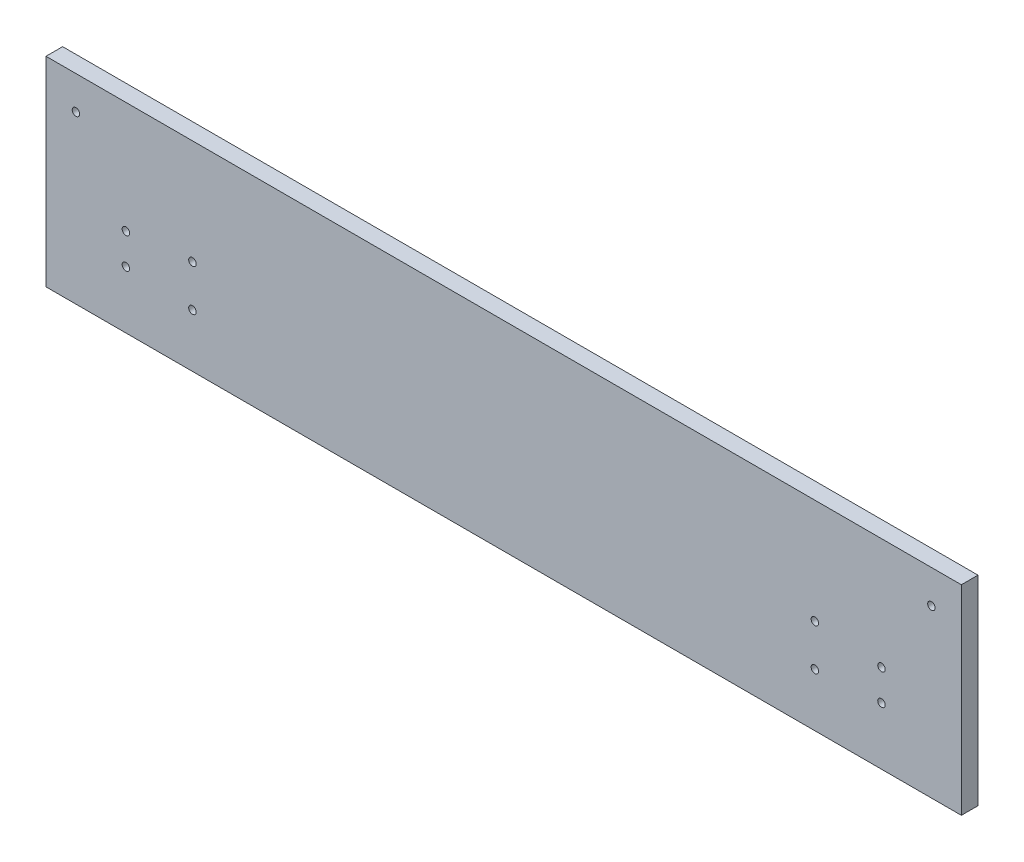
ISO-10303-21;
HEADER;
FILE_DESCRIPTION(('STEP AP214'),'2;1');
FILE_NAME('part.step','',(''),(''),'','','');
FILE_SCHEMA(('AUTOMOTIVE_DESIGN { 1 0 10303 214 1 1 1 1 }'));
ENDSEC;
DATA;
#1=APPLICATION_CONTEXT('core data for automotive mechanical design processes');
#2=APPLICATION_PROTOCOL_DEFINITION('international standard','automotive_design',2000,#1);
#3=PRODUCT_CONTEXT('',#1,'mechanical');
#4=PRODUCT('Part','Part','',(#3));
#5=PRODUCT_RELATED_PRODUCT_CATEGORY('part','',(#4));
#6=PRODUCT_DEFINITION_FORMATION('','',#4);
#7=PRODUCT_DEFINITION_CONTEXT('part definition',#1,'design');
#8=PRODUCT_DEFINITION('design','',#6,#7);
#9=PRODUCT_DEFINITION_SHAPE('','',#8);
#10=(LENGTH_UNIT() NAMED_UNIT(*) SI_UNIT(.MILLI.,.METRE.));
#11=(NAMED_UNIT(*) PLANE_ANGLE_UNIT() SI_UNIT($,.RADIAN.));
#12=(NAMED_UNIT(*) SI_UNIT($,.STERADIAN.) SOLID_ANGLE_UNIT());
#13=UNCERTAINTY_MEASURE_WITH_UNIT(LENGTH_MEASURE(1.E-05),#10,'distance_accuracy_value','');
#14=(GEOMETRIC_REPRESENTATION_CONTEXT(3) GLOBAL_UNCERTAINTY_ASSIGNED_CONTEXT((#13)) GLOBAL_UNIT_ASSIGNED_CONTEXT((#10,
#11,#12)) REPRESENTATION_CONTEXT('',''));
#15=CARTESIAN_POINT('',(0.,0.,0.));
#16=DIRECTION('',(0.,0.,1.));
#17=DIRECTION('',(1.,0.,0.));
#18=AXIS2_PLACEMENT_3D('',#15,#16,#17);
#19=CARTESIAN_POINT('',(-275.,60.,10.));
#20=DIRECTION('',(1.,0.,0.));
#21=DIRECTION('',(0.,0.,-1.));
#22=AXIS2_PLACEMENT_3D('',#19,#20,#21);
#23=PLANE('',#22);
#24=DIRECTION('',(0.,-1.,0.));
#25=VECTOR('',#24,1.);
#26=CARTESIAN_POINT('',(-275.,60.,0.));
#27=LINE('',#26,#25);
#28=CARTESIAN_POINT('',(-275.,60.,0.));
#29=VERTEX_POINT('',#28);
#30=CARTESIAN_POINT('',(-275.,-60.,0.));
#31=VERTEX_POINT('',#30);
#32=EDGE_CURVE('E104',#29,#31,#27,.T.);
#33=ORIENTED_EDGE('',*,*,#32,.T.);
#34=DIRECTION('',(0.,0.,-1.));
#35=VECTOR('',#34,1.);
#36=CARTESIAN_POINT('',(-275.,-60.,10.));
#37=LINE('',#36,#35);
#38=CARTESIAN_POINT('',(-275.,-60.,10.));
#39=VERTEX_POINT('',#38);
#40=EDGE_CURVE('E11',#39,#31,#37,.T.);
#41=ORIENTED_EDGE('',*,*,#40,.F.);
#42=DIRECTION('',(0.,-1.,0.));
#43=VECTOR('',#42,1.);
#44=CARTESIAN_POINT('',(-275.,60.,10.));
#45=LINE('',#44,#43);
#46=CARTESIAN_POINT('',(-275.,60.,10.));
#47=VERTEX_POINT('',#46);
#48=EDGE_CURVE('E92',#47,#39,#45,.T.);
#49=ORIENTED_EDGE('',*,*,#48,.F.);
#50=DIRECTION('',(0.,0.,-1.));
#51=VECTOR('',#50,1.);
#52=CARTESIAN_POINT('',(-275.,60.,10.));
#53=LINE('',#52,#51);
#54=EDGE_CURVE('E100',#47,#29,#53,.T.);
#55=ORIENTED_EDGE('',*,*,#54,.T.);
#56=EDGE_LOOP('',(#33,#41,#49,#55));
#57=FACE_BOUND('',#56,.T.);
#58=ADVANCED_FACE('F41',(#57),#23,.F.);
#59=CARTESIAN_POINT('',(-275.,-60.,10.));
#60=DIRECTION('',(0.,1.,0.));
#61=DIRECTION('',(0.,0.,1.));
#62=AXIS2_PLACEMENT_3D('',#59,#60,#61);
#63=PLANE('',#62);
#64=DIRECTION('',(1.,0.,0.));
#65=VECTOR('',#64,1.);
#66=CARTESIAN_POINT('',(-275.,-60.,0.));
#67=LINE('',#66,#65);
#68=CARTESIAN_POINT('',(275.,-60.,0.));
#69=VERTEX_POINT('',#68);
#70=EDGE_CURVE('E96',#31,#69,#67,.T.);
#71=ORIENTED_EDGE('',*,*,#70,.T.);
#72=DIRECTION('',(0.,0.,-1.));
#73=VECTOR('',#72,1.);
#74=CARTESIAN_POINT('',(275.,-60.,10.));
#75=LINE('',#74,#73);
#76=CARTESIAN_POINT('',(275.,-60.,10.));
#77=VERTEX_POINT('',#76);
#78=EDGE_CURVE('E49',#77,#69,#75,.T.);
#79=ORIENTED_EDGE('',*,*,#78,.F.);
#80=DIRECTION('',(1.,0.,0.));
#81=VECTOR('',#80,1.);
#82=CARTESIAN_POINT('',(-275.,-60.,10.));
#83=LINE('',#82,#81);
#84=EDGE_CURVE('E87',#39,#77,#83,.T.);
#85=ORIENTED_EDGE('',*,*,#84,.F.);
#86=ORIENTED_EDGE('',*,*,#40,.T.);
#87=EDGE_LOOP('',(#71,#79,#85,#86));
#88=FACE_BOUND('',#87,.T.);
#89=ADVANCED_FACE('F95',(#88),#63,.F.);
#90=CARTESIAN_POINT('',(275.,60.,10.));
#91=DIRECTION('',(-1.,0.,0.));
#92=DIRECTION('',(0.,0.,1.));
#93=AXIS2_PLACEMENT_3D('',#90,#91,#92);
#94=PLANE('',#93);
#95=DIRECTION('',(0.,1.,0.));
#96=VECTOR('',#95,1.);
#97=CARTESIAN_POINT('',(275.,60.,0.));
#98=LINE('',#97,#96);
#99=CARTESIAN_POINT('',(275.,60.,0.));
#100=VERTEX_POINT('',#99);
#101=EDGE_CURVE('E74',#69,#100,#98,.T.);
#102=ORIENTED_EDGE('',*,*,#101,.T.);
#103=DIRECTION('',(0.,0.,-1.));
#104=VECTOR('',#103,1.);
#105=CARTESIAN_POINT('',(275.,60.,10.));
#106=LINE('',#105,#104);
#107=CARTESIAN_POINT('',(275.,60.,10.));
#108=VERTEX_POINT('',#107);
#109=EDGE_CURVE('E97',#108,#100,#106,.T.);
#110=ORIENTED_EDGE('',*,*,#109,.F.);
#111=DIRECTION('',(0.,1.,0.));
#112=VECTOR('',#111,1.);
#113=CARTESIAN_POINT('',(275.,60.,10.));
#114=LINE('',#113,#112);
#115=EDGE_CURVE('E90',#77,#108,#114,.T.);
#116=ORIENTED_EDGE('',*,*,#115,.F.);
#117=ORIENTED_EDGE('',*,*,#78,.T.);
#118=EDGE_LOOP('',(#102,#110,#116,#117));
#119=FACE_BOUND('',#118,.T.);
#120=ADVANCED_FACE('F98',(#119),#94,.F.);
#121=CARTESIAN_POINT('',(-275.,60.,10.));
#122=DIRECTION('',(0.,-1.,0.));
#123=DIRECTION('',(0.,0.,-1.));
#124=AXIS2_PLACEMENT_3D('',#121,#122,#123);
#125=PLANE('',#124);
#126=DIRECTION('',(-1.,0.,0.));
#127=VECTOR('',#126,1.);
#128=CARTESIAN_POINT('',(-275.,60.,0.));
#129=LINE('',#128,#127);
#130=EDGE_CURVE('E80',#100,#29,#129,.T.);
#131=ORIENTED_EDGE('',*,*,#130,.T.);
#132=ORIENTED_EDGE('',*,*,#54,.F.);
#133=DIRECTION('',(-1.,0.,0.));
#134=VECTOR('',#133,1.);
#135=CARTESIAN_POINT('',(-275.,60.,10.));
#136=LINE('',#135,#134);
#137=EDGE_CURVE('E57',#108,#47,#136,.T.);
#138=ORIENTED_EDGE('',*,*,#137,.F.);
#139=ORIENTED_EDGE('',*,*,#109,.T.);
#140=EDGE_LOOP('',(#131,#132,#138,#139));
#141=FACE_BOUND('',#140,.T.);
#142=ADVANCED_FACE('F112',(#141),#125,.F.);
#143=CARTESIAN_POINT('',(0.,0.,10.));
#144=DIRECTION('',(0.,0.,1.));
#145=DIRECTION('',(1.,0.,0.));
#146=AXIS2_PLACEMENT_3D('',#143,#144,#145);
#147=PLANE('',#146);
#148=CARTESIAN_POINT('',(187.,-28.,10.));
#149=DIRECTION('',(0.,0.,-1.));
#150=DIRECTION('',(-1.,0.,0.));
#151=AXIS2_PLACEMENT_3D('',#148,#149,#150);
#152=CIRCLE('',#151,2.25000000000001);
#153=CARTESIAN_POINT('',(184.75,-28.,10.));
#154=VERTEX_POINT('',#153);
#155=EDGE_CURVE('E160',#154,#154,#152,.T.);
#156=ORIENTED_EDGE('',*,*,#155,.T.);
#157=EDGE_LOOP('',(#156));
#158=FACE_BOUND('',#157,.T.);
#159=CARTESIAN_POINT('',(187.,-3.,10.));
#160=DIRECTION('',(0.,0.,-1.));
#161=DIRECTION('',(-1.,0.,0.));
#162=AXIS2_PLACEMENT_3D('',#159,#160,#161);
#163=CIRCLE('',#162,2.25000000000001);
#164=CARTESIAN_POINT('',(184.75,-3.,10.));
#165=VERTEX_POINT('',#164);
#166=EDGE_CURVE('E166',#165,#165,#163,.T.);
#167=ORIENTED_EDGE('',*,*,#166,.T.);
#168=EDGE_LOOP('',(#167));
#169=FACE_BOUND('',#168,.T.);
#170=CARTESIAN_POINT('',(-187.,-3.,10.));
#171=DIRECTION('',(0.,0.,-1.));
#172=DIRECTION('',(-1.,0.,0.));
#173=AXIS2_PLACEMENT_3D('',#170,#171,#172);
#174=CIRCLE('',#173,2.25000000000001);
#175=CARTESIAN_POINT('',(-189.25,-3.,10.));
#176=VERTEX_POINT('',#175);
#177=EDGE_CURVE('E172',#176,#176,#174,.T.);
#178=ORIENTED_EDGE('',*,*,#177,.T.);
#179=EDGE_LOOP('',(#178));
#180=FACE_BOUND('',#179,.T.);
#181=CARTESIAN_POINT('',(-187.,-28.,10.));
#182=DIRECTION('',(0.,0.,-1.));
#183=DIRECTION('',(-1.,0.,0.));
#184=AXIS2_PLACEMENT_3D('',#181,#182,#183);
#185=CIRCLE('',#184,2.25000000000001);
#186=CARTESIAN_POINT('',(-189.25,-28.,10.));
#187=VERTEX_POINT('',#186);
#188=EDGE_CURVE('E128',#187,#187,#185,.T.);
#189=ORIENTED_EDGE('',*,*,#188,.T.);
#190=EDGE_LOOP('',(#189));
#191=FACE_BOUND('',#190,.T.);
#192=CARTESIAN_POINT('',(256.999999999999,40.0000000000021,10.));
#193=DIRECTION('',(0.,0.,1.));
#194=DIRECTION('',(1.,0.,0.));
#195=AXIS2_PLACEMENT_3D('',#192,#193,#194);
#196=CIRCLE('',#195,2.24999999999995);
#197=CARTESIAN_POINT('',(259.249999999999,40.0000000000021,10.));
#198=VERTEX_POINT('',#197);
#199=EDGE_CURVE('E127',#198,#198,#196,.T.);
#200=ORIENTED_EDGE('',*,*,#199,.F.);
#201=EDGE_LOOP('',(#200));
#202=FACE_BOUND('',#201,.T.);
#203=CARTESIAN_POINT('',(-227.,-25.5,10.));
#204=DIRECTION('',(0.,0.,1.));
#205=DIRECTION('',(1.,0.,0.));
#206=AXIS2_PLACEMENT_3D('',#203,#204,#205);
#207=CIRCLE('',#206,2.25000000000001);
#208=CARTESIAN_POINT('',(-224.75,-25.5,10.));
#209=VERTEX_POINT('',#208);
#210=EDGE_CURVE('E121',#209,#209,#207,.T.);
#211=ORIENTED_EDGE('',*,*,#210,.F.);
#212=EDGE_LOOP('',(#211));
#213=FACE_BOUND('',#212,.T.);
#214=CARTESIAN_POINT('',(227.,-7.00000000000002,10.));
#215=DIRECTION('',(0.,0.,1.));
#216=DIRECTION('',(1.,0.,0.));
#217=AXIS2_PLACEMENT_3D('',#214,#215,#216);
#218=CIRCLE('',#217,2.25000000000001);
#219=CARTESIAN_POINT('',(229.25,-7.00000000000002,10.));
#220=VERTEX_POINT('',#219);
#221=EDGE_CURVE('E135',#220,#220,#218,.T.);
#222=ORIENTED_EDGE('',*,*,#221,.F.);
#223=EDGE_LOOP('',(#222));
#224=FACE_BOUND('',#223,.T.);
#225=CARTESIAN_POINT('',(227.,-25.5,10.));
#226=DIRECTION('',(0.,0.,1.));
#227=DIRECTION('',(1.,0.,0.));
#228=AXIS2_PLACEMENT_3D('',#225,#226,#227);
#229=CIRCLE('',#228,2.25000000000001);
#230=CARTESIAN_POINT('',(229.25,-25.5,10.));
#231=VERTEX_POINT('',#230);
#232=EDGE_CURVE('E136',#231,#231,#229,.T.);
#233=ORIENTED_EDGE('',*,*,#232,.F.);
#234=EDGE_LOOP('',(#233));
#235=FACE_BOUND('',#234,.T.);
#236=CARTESIAN_POINT('',(-257.,39.9999999999999,10.));
#237=DIRECTION('',(0.,0.,1.));
#238=DIRECTION('',(1.,0.,0.));
#239=AXIS2_PLACEMENT_3D('',#236,#237,#238);
#240=CIRCLE('',#239,2.24999999999995);
#241=CARTESIAN_POINT('',(-254.75,39.9999999999999,10.));
#242=VERTEX_POINT('',#241);
#243=EDGE_CURVE('E146',#242,#242,#240,.T.);
#244=ORIENTED_EDGE('',*,*,#243,.F.);
#245=EDGE_LOOP('',(#244));
#246=FACE_BOUND('',#245,.T.);
#247=CARTESIAN_POINT('',(-227.,-7.00000000000002,10.));
#248=DIRECTION('',(0.,0.,1.));
#249=DIRECTION('',(1.,0.,0.));
#250=AXIS2_PLACEMENT_3D('',#247,#248,#249);
#251=CIRCLE('',#250,2.25000000000001);
#252=CARTESIAN_POINT('',(-224.75,-7.00000000000002,10.));
#253=VERTEX_POINT('',#252);
#254=EDGE_CURVE('E118',#253,#253,#251,.T.);
#255=ORIENTED_EDGE('',*,*,#254,.F.);
#256=EDGE_LOOP('',(#255));
#257=FACE_BOUND('',#256,.T.);
#258=ORIENTED_EDGE('',*,*,#48,.T.);
#259=ORIENTED_EDGE('',*,*,#84,.T.);
#260=ORIENTED_EDGE('',*,*,#115,.T.);
#261=ORIENTED_EDGE('',*,*,#137,.T.);
#262=EDGE_LOOP('',(#258,#259,#260,#261));
#263=FACE_BOUND('',#262,.T.);
#264=ADVANCED_FACE('F88',(#158,#169,#180,#191,#202,#213,#224,#235,#246,#257,#263),#147,.T.);
#265=CARTESIAN_POINT('',(0.,0.,0.));
#266=DIRECTION('',(0.,0.,1.));
#267=DIRECTION('',(1.,0.,0.));
#268=AXIS2_PLACEMENT_3D('',#265,#266,#267);
#269=PLANE('',#268);
#270=CARTESIAN_POINT('',(187.,-28.,0.));
#271=DIRECTION('',(0.,0.,-1.));
#272=DIRECTION('',(-1.,0.,0.));
#273=AXIS2_PLACEMENT_3D('',#270,#271,#272);
#274=CIRCLE('',#273,2.25000000000001);
#275=CARTESIAN_POINT('',(184.75,-28.,0.));
#276=VERTEX_POINT('',#275);
#277=EDGE_CURVE('E163',#276,#276,#274,.T.);
#278=ORIENTED_EDGE('',*,*,#277,.F.);
#279=EDGE_LOOP('',(#278));
#280=FACE_BOUND('',#279,.T.);
#281=CARTESIAN_POINT('',(187.,-3.,0.));
#282=DIRECTION('',(0.,0.,-1.));
#283=DIRECTION('',(-1.,0.,0.));
#284=AXIS2_PLACEMENT_3D('',#281,#282,#283);
#285=CIRCLE('',#284,2.25000000000001);
#286=CARTESIAN_POINT('',(184.75,-3.,0.));
#287=VERTEX_POINT('',#286);
#288=EDGE_CURVE('E169',#287,#287,#285,.T.);
#289=ORIENTED_EDGE('',*,*,#288,.F.);
#290=EDGE_LOOP('',(#289));
#291=FACE_BOUND('',#290,.T.);
#292=CARTESIAN_POINT('',(-187.,-3.,0.));
#293=DIRECTION('',(0.,0.,-1.));
#294=DIRECTION('',(-1.,0.,0.));
#295=AXIS2_PLACEMENT_3D('',#292,#293,#294);
#296=CIRCLE('',#295,2.25000000000001);
#297=CARTESIAN_POINT('',(-189.25,-3.,0.));
#298=VERTEX_POINT('',#297);
#299=EDGE_CURVE('E157',#298,#298,#296,.T.);
#300=ORIENTED_EDGE('',*,*,#299,.F.);
#301=EDGE_LOOP('',(#300));
#302=FACE_BOUND('',#301,.T.);
#303=CARTESIAN_POINT('',(-187.,-28.,0.));
#304=DIRECTION('',(0.,0.,-1.));
#305=DIRECTION('',(-1.,0.,0.));
#306=AXIS2_PLACEMENT_3D('',#303,#304,#305);
#307=CIRCLE('',#306,2.25000000000001);
#308=CARTESIAN_POINT('',(-189.25,-28.,0.));
#309=VERTEX_POINT('',#308);
#310=EDGE_CURVE('E154',#309,#309,#307,.T.);
#311=ORIENTED_EDGE('',*,*,#310,.F.);
#312=EDGE_LOOP('',(#311));
#313=FACE_BOUND('',#312,.T.);
#314=CARTESIAN_POINT('',(256.999999999999,40.0000000000021,0.));
#315=DIRECTION('',(0.,0.,1.));
#316=DIRECTION('',(1.,0.,0.));
#317=AXIS2_PLACEMENT_3D('',#314,#315,#316);
#318=CIRCLE('',#317,2.24999999999995);
#319=CARTESIAN_POINT('',(259.249999999999,40.0000000000021,0.));
#320=VERTEX_POINT('',#319);
#321=EDGE_CURVE('E124',#320,#320,#318,.T.);
#322=ORIENTED_EDGE('',*,*,#321,.T.);
#323=EDGE_LOOP('',(#322));
#324=FACE_BOUND('',#323,.T.);
#325=CARTESIAN_POINT('',(-227.,-25.5,0.));
#326=DIRECTION('',(0.,0.,1.));
#327=DIRECTION('',(1.,0.,0.));
#328=AXIS2_PLACEMENT_3D('',#325,#326,#327);
#329=CIRCLE('',#328,2.25000000000001);
#330=CARTESIAN_POINT('',(-224.75,-25.5,0.));
#331=VERTEX_POINT('',#330);
#332=EDGE_CURVE('E139',#331,#331,#329,.T.);
#333=ORIENTED_EDGE('',*,*,#332,.T.);
#334=EDGE_LOOP('',(#333));
#335=FACE_BOUND('',#334,.T.);
#336=CARTESIAN_POINT('',(227.,-7.00000000000002,0.));
#337=DIRECTION('',(0.,0.,1.));
#338=DIRECTION('',(1.,0.,0.));
#339=AXIS2_PLACEMENT_3D('',#336,#337,#338);
#340=CIRCLE('',#339,2.25000000000001);
#341=CARTESIAN_POINT('',(229.25,-7.00000000000002,0.));
#342=VERTEX_POINT('',#341);
#343=EDGE_CURVE('E132',#342,#342,#340,.T.);
#344=ORIENTED_EDGE('',*,*,#343,.T.);
#345=EDGE_LOOP('',(#344));
#346=FACE_BOUND('',#345,.T.);
#347=CARTESIAN_POINT('',(227.,-25.5,0.));
#348=DIRECTION('',(0.,0.,1.));
#349=DIRECTION('',(1.,0.,0.));
#350=AXIS2_PLACEMENT_3D('',#347,#348,#349);
#351=CIRCLE('',#350,2.25000000000001);
#352=CARTESIAN_POINT('',(229.25,-25.5,0.));
#353=VERTEX_POINT('',#352);
#354=EDGE_CURVE('E149',#353,#353,#351,.T.);
#355=ORIENTED_EDGE('',*,*,#354,.T.);
#356=EDGE_LOOP('',(#355));
#357=FACE_BOUND('',#356,.T.);
#358=CARTESIAN_POINT('',(-257.,39.9999999999999,0.));
#359=DIRECTION('',(0.,0.,1.));
#360=DIRECTION('',(1.,0.,0.));
#361=AXIS2_PLACEMENT_3D('',#358,#359,#360);
#362=CIRCLE('',#361,2.24999999999995);
#363=CARTESIAN_POINT('',(-254.75,39.9999999999999,0.));
#364=VERTEX_POINT('',#363);
#365=EDGE_CURVE('E131',#364,#364,#362,.T.);
#366=ORIENTED_EDGE('',*,*,#365,.T.);
#367=EDGE_LOOP('',(#366));
#368=FACE_BOUND('',#367,.T.);
#369=CARTESIAN_POINT('',(-227.,-7.00000000000002,0.));
#370=DIRECTION('',(0.,0.,1.));
#371=DIRECTION('',(1.,0.,0.));
#372=AXIS2_PLACEMENT_3D('',#369,#370,#371);
#373=CIRCLE('',#372,2.25000000000001);
#374=CARTESIAN_POINT('',(-224.75,-7.00000000000002,0.));
#375=VERTEX_POINT('',#374);
#376=EDGE_CURVE('E107',#375,#375,#373,.T.);
#377=ORIENTED_EDGE('',*,*,#376,.T.);
#378=EDGE_LOOP('',(#377));
#379=FACE_BOUND('',#378,.T.);
#380=ORIENTED_EDGE('',*,*,#32,.F.);
#381=ORIENTED_EDGE('',*,*,#130,.F.);
#382=ORIENTED_EDGE('',*,*,#101,.F.);
#383=ORIENTED_EDGE('',*,*,#70,.F.);
#384=EDGE_LOOP('',(#380,#381,#382,#383));
#385=FACE_BOUND('',#384,.T.);
#386=ADVANCED_FACE('F115',(#280,#291,#302,#313,#324,#335,#346,#357,#368,#379,#385),#269,.F.);
#387=CARTESIAN_POINT('',(-227.,-7.00000000000002,0.));
#388=DIRECTION('',(0.,0.,1.));
#389=DIRECTION('',(1.,0.,0.));
#390=AXIS2_PLACEMENT_3D('',#387,#388,#389);
#391=CYLINDRICAL_SURFACE('',#390,2.25000000000001);
#392=ORIENTED_EDGE('',*,*,#376,.F.);
#393=EDGE_LOOP('',(#392));
#394=FACE_BOUND('',#393,.T.);
#395=ORIENTED_EDGE('',*,*,#254,.T.);
#396=EDGE_LOOP('',(#395));
#397=FACE_BOUND('',#396,.T.);
#398=ADVANCED_FACE('F182',(#394,#397),#391,.F.);
#399=CARTESIAN_POINT('',(-257.,39.9999999999999,0.));
#400=DIRECTION('',(0.,0.,1.));
#401=DIRECTION('',(1.,0.,0.));
#402=AXIS2_PLACEMENT_3D('',#399,#400,#401);
#403=CYLINDRICAL_SURFACE('',#402,2.24999999999995);
#404=ORIENTED_EDGE('',*,*,#365,.F.);
#405=EDGE_LOOP('',(#404));
#406=FACE_BOUND('',#405,.T.);
#407=ORIENTED_EDGE('',*,*,#243,.T.);
#408=EDGE_LOOP('',(#407));
#409=FACE_BOUND('',#408,.T.);
#410=ADVANCED_FACE('F201',(#406,#409),#403,.F.);
#411=CARTESIAN_POINT('',(227.,-25.5,0.));
#412=DIRECTION('',(0.,0.,1.));
#413=DIRECTION('',(1.,0.,0.));
#414=AXIS2_PLACEMENT_3D('',#411,#412,#413);
#415=CYLINDRICAL_SURFACE('',#414,2.25000000000001);
#416=ORIENTED_EDGE('',*,*,#354,.F.);
#417=EDGE_LOOP('',(#416));
#418=FACE_BOUND('',#417,.T.);
#419=ORIENTED_EDGE('',*,*,#232,.T.);
#420=EDGE_LOOP('',(#419));
#421=FACE_BOUND('',#420,.T.);
#422=ADVANCED_FACE('F246',(#418,#421),#415,.F.);
#423=CARTESIAN_POINT('',(227.,-7.00000000000002,0.));
#424=DIRECTION('',(0.,0.,1.));
#425=DIRECTION('',(1.,0.,0.));
#426=AXIS2_PLACEMENT_3D('',#423,#424,#425);
#427=CYLINDRICAL_SURFACE('',#426,2.25000000000001);
#428=ORIENTED_EDGE('',*,*,#343,.F.);
#429=EDGE_LOOP('',(#428));
#430=FACE_BOUND('',#429,.T.);
#431=ORIENTED_EDGE('',*,*,#221,.T.);
#432=EDGE_LOOP('',(#431));
#433=FACE_BOUND('',#432,.T.);
#434=ADVANCED_FACE('F257',(#430,#433),#427,.F.);
#435=CARTESIAN_POINT('',(-227.,-25.5,0.));
#436=DIRECTION('',(0.,0.,1.));
#437=DIRECTION('',(1.,0.,0.));
#438=AXIS2_PLACEMENT_3D('',#435,#436,#437);
#439=CYLINDRICAL_SURFACE('',#438,2.25000000000001);
#440=ORIENTED_EDGE('',*,*,#332,.F.);
#441=EDGE_LOOP('',(#440));
#442=FACE_BOUND('',#441,.T.);
#443=ORIENTED_EDGE('',*,*,#210,.T.);
#444=EDGE_LOOP('',(#443));
#445=FACE_BOUND('',#444,.T.);
#446=ADVANCED_FACE('F268',(#442,#445),#439,.F.);
#447=CARTESIAN_POINT('',(256.999999999999,40.0000000000021,0.));
#448=DIRECTION('',(0.,0.,1.));
#449=DIRECTION('',(1.,0.,0.));
#450=AXIS2_PLACEMENT_3D('',#447,#448,#449);
#451=CYLINDRICAL_SURFACE('',#450,2.24999999999995);
#452=ORIENTED_EDGE('',*,*,#321,.F.);
#453=EDGE_LOOP('',(#452));
#454=FACE_BOUND('',#453,.T.);
#455=ORIENTED_EDGE('',*,*,#199,.T.);
#456=EDGE_LOOP('',(#455));
#457=FACE_BOUND('',#456,.T.);
#458=ADVANCED_FACE('F279',(#454,#457),#451,.F.);
#459=CARTESIAN_POINT('',(-187.,-28.,10.));
#460=DIRECTION('',(0.,0.,-1.));
#461=DIRECTION('',(-1.,0.,0.));
#462=AXIS2_PLACEMENT_3D('',#459,#460,#461);
#463=CYLINDRICAL_SURFACE('',#462,2.25000000000001);
#464=ORIENTED_EDGE('',*,*,#188,.F.);
#465=EDGE_LOOP('',(#464));
#466=FACE_BOUND('',#465,.T.);
#467=ORIENTED_EDGE('',*,*,#310,.T.);
#468=EDGE_LOOP('',(#467));
#469=FACE_BOUND('',#468,.T.);
#470=ADVANCED_FACE('F289',(#466,#469),#463,.F.);
#471=CARTESIAN_POINT('',(-187.,-3.,10.));
#472=DIRECTION('',(0.,0.,-1.));
#473=DIRECTION('',(-1.,0.,0.));
#474=AXIS2_PLACEMENT_3D('',#471,#472,#473);
#475=CYLINDRICAL_SURFACE('',#474,2.25000000000001);
#476=ORIENTED_EDGE('',*,*,#177,.F.);
#477=EDGE_LOOP('',(#476));
#478=FACE_BOUND('',#477,.T.);
#479=ORIENTED_EDGE('',*,*,#299,.T.);
#480=EDGE_LOOP('',(#479));
#481=FACE_BOUND('',#480,.T.);
#482=ADVANCED_FACE('F178',(#478,#481),#475,.F.);
#483=CARTESIAN_POINT('',(187.,-3.,10.));
#484=DIRECTION('',(0.,0.,-1.));
#485=DIRECTION('',(-1.,0.,0.));
#486=AXIS2_PLACEMENT_3D('',#483,#484,#485);
#487=CYLINDRICAL_SURFACE('',#486,2.25000000000001);
#488=ORIENTED_EDGE('',*,*,#166,.F.);
#489=EDGE_LOOP('',(#488));
#490=FACE_BOUND('',#489,.T.);
#491=ORIENTED_EDGE('',*,*,#288,.T.);
#492=EDGE_LOOP('',(#491));
#493=FACE_BOUND('',#492,.T.);
#494=ADVANCED_FACE('F321',(#490,#493),#487,.F.);
#495=CARTESIAN_POINT('',(187.,-28.,10.));
#496=DIRECTION('',(0.,0.,-1.));
#497=DIRECTION('',(-1.,0.,0.));
#498=AXIS2_PLACEMENT_3D('',#495,#496,#497);
#499=CYLINDRICAL_SURFACE('',#498,2.25000000000001);
#500=ORIENTED_EDGE('',*,*,#155,.F.);
#501=EDGE_LOOP('',(#500));
#502=FACE_BOUND('',#501,.T.);
#503=ORIENTED_EDGE('',*,*,#277,.T.);
#504=EDGE_LOOP('',(#503));
#505=FACE_BOUND('',#504,.T.);
#506=ADVANCED_FACE('F332',(#502,#505),#499,.F.);
#507=CLOSED_SHELL('',(#58,#89,#120,#142,#264,#386,#398,#410,#422,#434,#446,#458,#470,#482,#494,#506));
#508=MANIFOLD_SOLID_BREP('B2',#507);
#509=ADVANCED_BREP_SHAPE_REPRESENTATION('',(#18,#508),#14);
#510=SHAPE_DEFINITION_REPRESENTATION(#9,#509);
ENDSEC;
END-ISO-10303-21;
